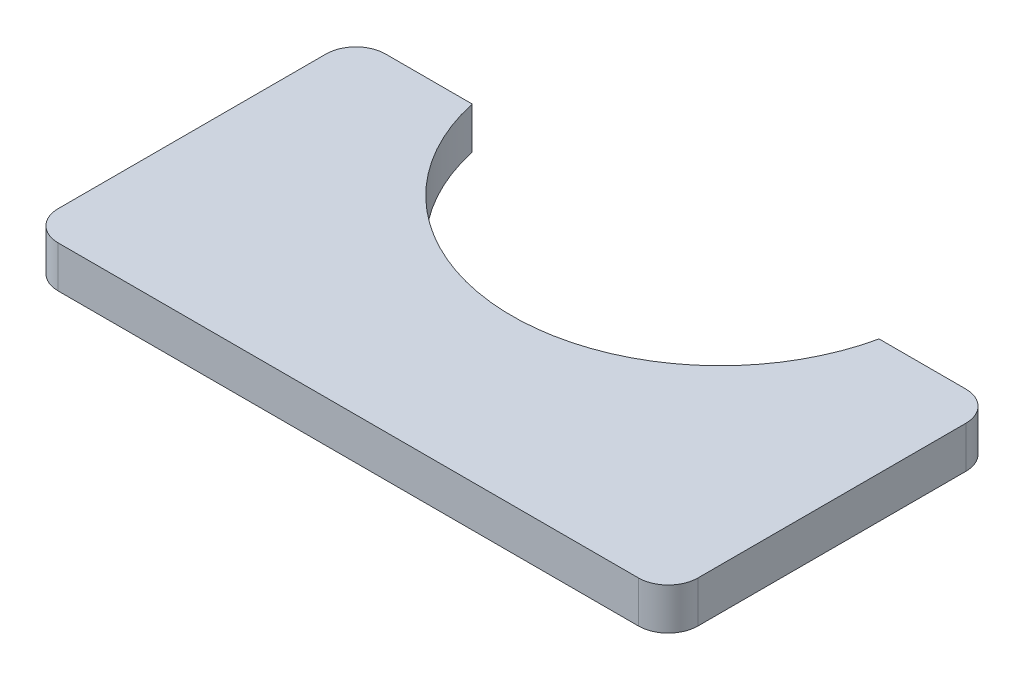
ISO-10303-21;
HEADER;
FILE_DESCRIPTION(('STEP AP214'),'2;1');
FILE_NAME('part.step','',(''),(''),'','','');
FILE_SCHEMA(('AUTOMOTIVE_DESIGN { 1 0 10303 214 1 1 1 1 }'));
ENDSEC;
DATA;
#1=APPLICATION_CONTEXT('core data for automotive mechanical design processes');
#2=APPLICATION_PROTOCOL_DEFINITION('international standard','automotive_design',2000,#1);
#3=PRODUCT_CONTEXT('',#1,'mechanical');
#4=PRODUCT('Part','Part','',(#3));
#5=PRODUCT_RELATED_PRODUCT_CATEGORY('part','',(#4));
#6=PRODUCT_DEFINITION_FORMATION('','',#4);
#7=PRODUCT_DEFINITION_CONTEXT('part definition',#1,'design');
#8=PRODUCT_DEFINITION('design','',#6,#7);
#9=PRODUCT_DEFINITION_SHAPE('','',#8);
#10=(LENGTH_UNIT() NAMED_UNIT(*) SI_UNIT(.MILLI.,.METRE.));
#11=(NAMED_UNIT(*) PLANE_ANGLE_UNIT() SI_UNIT($,.RADIAN.));
#12=(NAMED_UNIT(*) SI_UNIT($,.STERADIAN.) SOLID_ANGLE_UNIT());
#13=UNCERTAINTY_MEASURE_WITH_UNIT(LENGTH_MEASURE(1.E-05),#10,'distance_accuracy_value','');
#14=(GEOMETRIC_REPRESENTATION_CONTEXT(3) GLOBAL_UNCERTAINTY_ASSIGNED_CONTEXT((#13)) GLOBAL_UNIT_ASSIGNED_CONTEXT((#10,
#11,#12)) REPRESENTATION_CONTEXT('',''));
#15=CARTESIAN_POINT('',(0.,0.,0.));
#16=DIRECTION('',(0.,0.,1.));
#17=DIRECTION('',(1.,0.,0.));
#18=AXIS2_PLACEMENT_3D('',#15,#16,#17);
#19=CARTESIAN_POINT('',(-21.5,2.8,-11.));
#20=DIRECTION('',(0.,0.,1.));
#21=DIRECTION('',(1.,0.,0.));
#22=AXIS2_PLACEMENT_3D('',#19,#20,#21);
#23=PLANE('',#22);
#24=DIRECTION('',(-1.,0.,0.));
#25=VECTOR('',#24,1.);
#26=CARTESIAN_POINT('',(-21.5,2.8,-11.));
#27=LINE('',#26,#25);
#28=CARTESIAN_POINT('',(19.5,2.8,-11.));
#29=VERTEX_POINT('',#28);
#30=CARTESIAN_POINT('',(13.6747943311773,2.8,-11.));
#31=VERTEX_POINT('',#30);
#32=EDGE_CURVE('E211',#29,#31,#27,.T.);
#33=ORIENTED_EDGE('',*,*,#32,.F.);
#34=DIRECTION('',(0.,-1.,0.));
#35=VECTOR('',#34,1.);
#36=CARTESIAN_POINT('',(19.5,2.8,-11.));
#37=LINE('',#36,#35);
#38=CARTESIAN_POINT('',(19.5,0.,-11.));
#39=VERTEX_POINT('',#38);
#40=EDGE_CURVE('E130',#29,#39,#37,.T.);
#41=ORIENTED_EDGE('',*,*,#40,.T.);
#42=DIRECTION('',(-1.,0.,0.));
#43=VECTOR('',#42,1.);
#44=CARTESIAN_POINT('',(-21.5,0.,-11.));
#45=LINE('',#44,#43);
#46=CARTESIAN_POINT('',(13.6747943311773,0.,-11.));
#47=VERTEX_POINT('',#46);
#48=EDGE_CURVE('E148',#39,#47,#45,.T.);
#49=ORIENTED_EDGE('',*,*,#48,.T.);
#50=DIRECTION('',(0.,1.,0.));
#51=VECTOR('',#50,1.);
#52=CARTESIAN_POINT('',(13.6747943311773,0.,-11.));
#53=LINE('',#52,#51);
#54=EDGE_CURVE('E125',#47,#31,#53,.T.);
#55=ORIENTED_EDGE('',*,*,#54,.T.);
#56=EDGE_LOOP('',(#33,#41,#49,#55));
#57=FACE_BOUND('',#56,.T.);
#58=ADVANCED_FACE('F39',(#57),#23,.F.);
#59=CARTESIAN_POINT('',(21.5,2.8,-11.));
#60=DIRECTION('',(-1.,0.,0.));
#61=DIRECTION('',(0.,0.,1.));
#62=AXIS2_PLACEMENT_3D('',#59,#60,#61);
#63=PLANE('',#62);
#64=DIRECTION('',(0.,0.,-1.));
#65=VECTOR('',#64,1.);
#66=CARTESIAN_POINT('',(21.5,0.,-11.));
#67=LINE('',#66,#65);
#68=CARTESIAN_POINT('',(21.5,0.,9.));
#69=VERTEX_POINT('',#68);
#70=CARTESIAN_POINT('',(21.5,0.,-9.));
#71=VERTEX_POINT('',#70);
#72=EDGE_CURVE('E149',#69,#71,#67,.T.);
#73=ORIENTED_EDGE('',*,*,#72,.T.);
#74=DIRECTION('',(0.,-1.,0.));
#75=VECTOR('',#74,1.);
#76=CARTESIAN_POINT('',(21.5,2.8,-9.));
#77=LINE('',#76,#75);
#78=CARTESIAN_POINT('',(21.5,2.8,-9.));
#79=VERTEX_POINT('',#78);
#80=EDGE_CURVE('E183',#71,#79,#77,.F.);
#81=ORIENTED_EDGE('',*,*,#80,.T.);
#82=DIRECTION('',(0.,0.,-1.));
#83=VECTOR('',#82,1.);
#84=CARTESIAN_POINT('',(21.5,2.8,-11.));
#85=LINE('',#84,#83);
#86=CARTESIAN_POINT('',(21.5,2.8,9.));
#87=VERTEX_POINT('',#86);
#88=EDGE_CURVE('E163',#87,#79,#85,.T.);
#89=ORIENTED_EDGE('',*,*,#88,.F.);
#90=DIRECTION('',(0.,-1.,0.));
#91=VECTOR('',#90,1.);
#92=CARTESIAN_POINT('',(21.5,2.8,9.));
#93=LINE('',#92,#91);
#94=EDGE_CURVE('E179',#87,#69,#93,.T.);
#95=ORIENTED_EDGE('',*,*,#94,.T.);
#96=EDGE_LOOP('',(#73,#81,#89,#95));
#97=FACE_BOUND('',#96,.T.);
#98=ADVANCED_FACE('F231',(#97),#63,.F.);
#99=CARTESIAN_POINT('',(-13.6747943311773,0.,-11.));
#100=VERTEX_POINT('',#99);
#101=CARTESIAN_POINT('',(-19.5,0.,-11.));
#102=VERTEX_POINT('',#101);
#103=EDGE_CURVE('E137',#100,#102,#45,.T.);
#104=ORIENTED_EDGE('',*,*,#103,.T.);
#105=DIRECTION('',(0.,-1.,0.));
#106=VECTOR('',#105,1.);
#107=CARTESIAN_POINT('',(-19.5,2.8,-11.));
#108=LINE('',#107,#106);
#109=CARTESIAN_POINT('',(-19.5,2.8,-11.));
#110=VERTEX_POINT('',#109);
#111=EDGE_CURVE('E204',#102,#110,#108,.F.);
#112=ORIENTED_EDGE('',*,*,#111,.T.);
#113=CARTESIAN_POINT('',(-13.6747943311773,2.8,-11.));
#114=VERTEX_POINT('',#113);
#115=EDGE_CURVE('E140',#114,#110,#27,.T.);
#116=ORIENTED_EDGE('',*,*,#115,.F.);
#117=DIRECTION('',(0.,1.,0.));
#118=VECTOR('',#117,1.);
#119=CARTESIAN_POINT('',(-13.6747943311773,0.,-11.));
#120=LINE('',#119,#118);
#121=EDGE_CURVE('E122',#114,#100,#120,.F.);
#122=ORIENTED_EDGE('',*,*,#121,.T.);
#123=EDGE_LOOP('',(#104,#112,#116,#122));
#124=FACE_BOUND('',#123,.T.);
#125=ADVANCED_FACE('F136',(#124),#23,.F.);
#126=CARTESIAN_POINT('',(-21.5,2.8,-11.));
#127=DIRECTION('',(1.,0.,0.));
#128=DIRECTION('',(0.,0.,-1.));
#129=AXIS2_PLACEMENT_3D('',#126,#127,#128);
#130=PLANE('',#129);
#131=DIRECTION('',(0.,0.,1.));
#132=VECTOR('',#131,1.);
#133=CARTESIAN_POINT('',(-21.5,2.8,-11.));
#134=LINE('',#133,#132);
#135=CARTESIAN_POINT('',(-21.5,2.8,-9.));
#136=VERTEX_POINT('',#135);
#137=CARTESIAN_POINT('',(-21.5,2.8,9.));
#138=VERTEX_POINT('',#137);
#139=EDGE_CURVE('E209',#136,#138,#134,.T.);
#140=ORIENTED_EDGE('',*,*,#139,.F.);
#141=DIRECTION('',(0.,-1.,0.));
#142=VECTOR('',#141,1.);
#143=CARTESIAN_POINT('',(-21.5,2.8,-9.));
#144=LINE('',#143,#142);
#145=CARTESIAN_POINT('',(-21.5,0.,-9.));
#146=VERTEX_POINT('',#145);
#147=EDGE_CURVE('E200',#136,#146,#144,.T.);
#148=ORIENTED_EDGE('',*,*,#147,.T.);
#149=DIRECTION('',(0.,0.,1.));
#150=VECTOR('',#149,1.);
#151=CARTESIAN_POINT('',(-21.5,0.,-11.));
#152=LINE('',#151,#150);
#153=CARTESIAN_POINT('',(-21.5,0.,9.));
#154=VERTEX_POINT('',#153);
#155=EDGE_CURVE('E153',#146,#154,#152,.T.);
#156=ORIENTED_EDGE('',*,*,#155,.T.);
#157=DIRECTION('',(0.,-1.,0.));
#158=VECTOR('',#157,1.);
#159=CARTESIAN_POINT('',(-21.5,2.8,9.));
#160=LINE('',#159,#158);
#161=EDGE_CURVE('E197',#154,#138,#160,.F.);
#162=ORIENTED_EDGE('',*,*,#161,.T.);
#163=EDGE_LOOP('',(#140,#148,#156,#162));
#164=FACE_BOUND('',#163,.T.);
#165=ADVANCED_FACE('F243',(#164),#130,.F.);
#166=CARTESIAN_POINT('',(-21.5,2.8,11.));
#167=DIRECTION('',(0.,0.,-1.));
#168=DIRECTION('',(-1.,0.,0.));
#169=AXIS2_PLACEMENT_3D('',#166,#167,#168);
#170=PLANE('',#169);
#171=DIRECTION('',(1.,0.,0.));
#172=VECTOR('',#171,1.);
#173=CARTESIAN_POINT('',(-21.5,2.8,11.));
#174=LINE('',#173,#172);
#175=CARTESIAN_POINT('',(-19.5,2.8,11.));
#176=VERTEX_POINT('',#175);
#177=CARTESIAN_POINT('',(19.5,2.8,11.));
#178=VERTEX_POINT('',#177);
#179=EDGE_CURVE('E131',#176,#178,#174,.T.);
#180=ORIENTED_EDGE('',*,*,#179,.F.);
#181=DIRECTION('',(0.,-1.,0.));
#182=VECTOR('',#181,1.);
#183=CARTESIAN_POINT('',(-19.5,2.8,11.));
#184=LINE('',#183,#182);
#185=CARTESIAN_POINT('',(-19.5,0.,11.));
#186=VERTEX_POINT('',#185);
#187=EDGE_CURVE('E11',#176,#186,#184,.T.);
#188=ORIENTED_EDGE('',*,*,#187,.T.);
#189=DIRECTION('',(1.,0.,0.));
#190=VECTOR('',#189,1.);
#191=CARTESIAN_POINT('',(-21.5,0.,11.));
#192=LINE('',#191,#190);
#193=CARTESIAN_POINT('',(19.5,0.,11.));
#194=VERTEX_POINT('',#193);
#195=EDGE_CURVE('E161',#186,#194,#192,.T.);
#196=ORIENTED_EDGE('',*,*,#195,.T.);
#197=DIRECTION('',(0.,-1.,0.));
#198=VECTOR('',#197,1.);
#199=CARTESIAN_POINT('',(19.5,2.8,11.));
#200=LINE('',#199,#198);
#201=EDGE_CURVE('E48',#194,#178,#200,.F.);
#202=ORIENTED_EDGE('',*,*,#201,.T.);
#203=EDGE_LOOP('',(#180,#188,#196,#202));
#204=FACE_BOUND('',#203,.T.);
#205=ADVANCED_FACE('F236',(#204),#170,.F.);
#206=CARTESIAN_POINT('',(0.,2.8,0.));
#207=DIRECTION('',(0.,1.,0.));
#208=DIRECTION('',(0.,0.,1.));
#209=AXIS2_PLACEMENT_3D('',#206,#207,#208);
#210=PLANE('',#209);
#211=ORIENTED_EDGE('',*,*,#88,.T.);
#212=CARTESIAN_POINT('',(19.5,2.8,-9.));
#213=DIRECTION('',(0.,1.,0.));
#214=DIRECTION('',(0.,0.,1.));
#215=AXIS2_PLACEMENT_3D('',#212,#213,#214);
#216=CIRCLE('',#215,2.);
#217=EDGE_CURVE('E194',#79,#29,#216,.T.);
#218=ORIENTED_EDGE('',*,*,#217,.T.);
#219=ORIENTED_EDGE('',*,*,#32,.T.);
#220=CARTESIAN_POINT('',(0.,2.8,-14.));
#221=DIRECTION('',(0.,1.,0.));
#222=DIRECTION('',(0.,0.,1.));
#223=AXIS2_PLACEMENT_3D('',#220,#221,#222);
#224=CIRCLE('',#223,14.);
#225=EDGE_CURVE('E142',#114,#31,#224,.T.);
#226=ORIENTED_EDGE('',*,*,#225,.F.);
#227=ORIENTED_EDGE('',*,*,#115,.T.);
#228=CARTESIAN_POINT('',(-19.5,2.8,-9.));
#229=DIRECTION('',(0.,1.,0.));
#230=DIRECTION('',(0.,0.,1.));
#231=AXIS2_PLACEMENT_3D('',#228,#229,#230);
#232=CIRCLE('',#231,2.);
#233=EDGE_CURVE('E191',#110,#136,#232,.T.);
#234=ORIENTED_EDGE('',*,*,#233,.T.);
#235=ORIENTED_EDGE('',*,*,#139,.T.);
#236=CARTESIAN_POINT('',(-19.5,2.8,9.));
#237=DIRECTION('',(0.,1.,0.));
#238=DIRECTION('',(0.,0.,1.));
#239=AXIS2_PLACEMENT_3D('',#236,#237,#238);
#240=CIRCLE('',#239,2.);
#241=EDGE_CURVE('E61',#138,#176,#240,.T.);
#242=ORIENTED_EDGE('',*,*,#241,.T.);
#243=ORIENTED_EDGE('',*,*,#179,.T.);
#244=CARTESIAN_POINT('',(19.5,2.8,9.));
#245=DIRECTION('',(0.,1.,0.));
#246=DIRECTION('',(0.,0.,1.));
#247=AXIS2_PLACEMENT_3D('',#244,#245,#246);
#248=CIRCLE('',#247,2.);
#249=EDGE_CURVE('E186',#178,#87,#248,.T.);
#250=ORIENTED_EDGE('',*,*,#249,.T.);
#251=EDGE_LOOP('',(#211,#218,#219,#226,#227,#234,#235,#242,#243,#250));
#252=FACE_BOUND('',#251,.T.);
#253=ADVANCED_FACE('F234',(#252),#210,.T.);
#254=CARTESIAN_POINT('',(0.,0.,0.));
#255=DIRECTION('',(0.,1.,0.));
#256=DIRECTION('',(0.,0.,1.));
#257=AXIS2_PLACEMENT_3D('',#254,#255,#256);
#258=PLANE('',#257);
#259=ORIENTED_EDGE('',*,*,#48,.F.);
#260=CARTESIAN_POINT('',(19.5,0.,-9.));
#261=DIRECTION('',(0.,1.,0.));
#262=DIRECTION('',(0.,0.,1.));
#263=AXIS2_PLACEMENT_3D('',#260,#261,#262);
#264=CIRCLE('',#263,2.);
#265=EDGE_CURVE('E176',#39,#71,#264,.F.);
#266=ORIENTED_EDGE('',*,*,#265,.T.);
#267=ORIENTED_EDGE('',*,*,#72,.F.);
#268=CARTESIAN_POINT('',(19.5,0.,9.));
#269=DIRECTION('',(0.,1.,0.));
#270=DIRECTION('',(0.,0.,1.));
#271=AXIS2_PLACEMENT_3D('',#268,#269,#270);
#272=CIRCLE('',#271,2.);
#273=EDGE_CURVE('E168',#69,#194,#272,.F.);
#274=ORIENTED_EDGE('',*,*,#273,.T.);
#275=ORIENTED_EDGE('',*,*,#195,.F.);
#276=CARTESIAN_POINT('',(-19.5,0.,9.));
#277=DIRECTION('',(0.,1.,0.));
#278=DIRECTION('',(0.,0.,1.));
#279=AXIS2_PLACEMENT_3D('',#276,#277,#278);
#280=CIRCLE('',#279,2.);
#281=EDGE_CURVE('E171',#186,#154,#280,.F.);
#282=ORIENTED_EDGE('',*,*,#281,.T.);
#283=ORIENTED_EDGE('',*,*,#155,.F.);
#284=CARTESIAN_POINT('',(-19.5,0.,-9.));
#285=DIRECTION('',(0.,1.,0.));
#286=DIRECTION('',(0.,0.,1.));
#287=AXIS2_PLACEMENT_3D('',#284,#285,#286);
#288=CIRCLE('',#287,2.);
#289=EDGE_CURVE('E146',#146,#102,#288,.F.);
#290=ORIENTED_EDGE('',*,*,#289,.T.);
#291=ORIENTED_EDGE('',*,*,#103,.F.);
#292=CARTESIAN_POINT('',(0.,0.,-14.));
#293=DIRECTION('',(0.,1.,0.));
#294=DIRECTION('',(0.,0.,1.));
#295=AXIS2_PLACEMENT_3D('',#292,#293,#294);
#296=CIRCLE('',#295,14.);
#297=EDGE_CURVE('E118',#100,#47,#296,.T.);
#298=ORIENTED_EDGE('',*,*,#297,.T.);
#299=EDGE_LOOP('',(#259,#266,#267,#274,#275,#282,#283,#290,#291,#298));
#300=FACE_BOUND('',#299,.T.);
#301=ADVANCED_FACE('F144',(#300),#258,.F.);
#302=CARTESIAN_POINT('',(0.,0.,-14.));
#303=DIRECTION('',(0.,1.,0.));
#304=DIRECTION('',(0.,0.,1.));
#305=AXIS2_PLACEMENT_3D('',#302,#303,#304);
#306=CYLINDRICAL_SURFACE('',#305,14.);
#307=ORIENTED_EDGE('',*,*,#297,.F.);
#308=ORIENTED_EDGE('',*,*,#121,.F.);
#309=ORIENTED_EDGE('',*,*,#225,.T.);
#310=ORIENTED_EDGE('',*,*,#54,.F.);
#311=EDGE_LOOP('',(#307,#308,#309,#310));
#312=FACE_BOUND('',#311,.T.);
#313=ADVANCED_FACE('F120',(#312),#306,.F.);
#314=CARTESIAN_POINT('',(19.5,2.8,-9.));
#315=DIRECTION('',(0.,-1.,0.));
#316=DIRECTION('',(0.,0.,-1.));
#317=AXIS2_PLACEMENT_3D('',#314,#315,#316);
#318=CYLINDRICAL_SURFACE('',#317,2.);
#319=ORIENTED_EDGE('',*,*,#217,.F.);
#320=ORIENTED_EDGE('',*,*,#80,.F.);
#321=ORIENTED_EDGE('',*,*,#265,.F.);
#322=ORIENTED_EDGE('',*,*,#40,.F.);
#323=EDGE_LOOP('',(#319,#320,#321,#322));
#324=FACE_BOUND('',#323,.T.);
#325=ADVANCED_FACE('F233',(#324),#318,.T.);
#326=CARTESIAN_POINT('',(-19.5,2.8,-9.));
#327=DIRECTION('',(0.,-1.,0.));
#328=DIRECTION('',(0.,0.,-1.));
#329=AXIS2_PLACEMENT_3D('',#326,#327,#328);
#330=CYLINDRICAL_SURFACE('',#329,2.);
#331=ORIENTED_EDGE('',*,*,#233,.F.);
#332=ORIENTED_EDGE('',*,*,#111,.F.);
#333=ORIENTED_EDGE('',*,*,#289,.F.);
#334=ORIENTED_EDGE('',*,*,#147,.F.);
#335=EDGE_LOOP('',(#331,#332,#333,#334));
#336=FACE_BOUND('',#335,.T.);
#337=ADVANCED_FACE('F265',(#336),#330,.T.);
#338=CARTESIAN_POINT('',(-19.5,2.8,9.));
#339=DIRECTION('',(0.,-1.,0.));
#340=DIRECTION('',(0.,0.,-1.));
#341=AXIS2_PLACEMENT_3D('',#338,#339,#340);
#342=CYLINDRICAL_SURFACE('',#341,2.);
#343=ORIENTED_EDGE('',*,*,#241,.F.);
#344=ORIENTED_EDGE('',*,*,#161,.F.);
#345=ORIENTED_EDGE('',*,*,#281,.F.);
#346=ORIENTED_EDGE('',*,*,#187,.F.);
#347=EDGE_LOOP('',(#343,#344,#345,#346));
#348=FACE_BOUND('',#347,.T.);
#349=ADVANCED_FACE('F267',(#348),#342,.T.);
#350=CARTESIAN_POINT('',(19.5,2.8,9.));
#351=DIRECTION('',(0.,-1.,0.));
#352=DIRECTION('',(0.,0.,-1.));
#353=AXIS2_PLACEMENT_3D('',#350,#351,#352);
#354=CYLINDRICAL_SURFACE('',#353,2.);
#355=ORIENTED_EDGE('',*,*,#249,.F.);
#356=ORIENTED_EDGE('',*,*,#201,.F.);
#357=ORIENTED_EDGE('',*,*,#273,.F.);
#358=ORIENTED_EDGE('',*,*,#94,.F.);
#359=EDGE_LOOP('',(#355,#356,#357,#358));
#360=FACE_BOUND('',#359,.T.);
#361=ADVANCED_FACE('F41',(#360),#354,.T.);
#362=CLOSED_SHELL('',(#58,#98,#125,#165,#205,#253,#301,#313,#325,#337,#349,#361));
#363=MANIFOLD_SOLID_BREP('B2',#362);
#364=ADVANCED_BREP_SHAPE_REPRESENTATION('',(#18,#363),#14);
#365=SHAPE_DEFINITION_REPRESENTATION(#9,#364);
ENDSEC;
END-ISO-10303-21;
